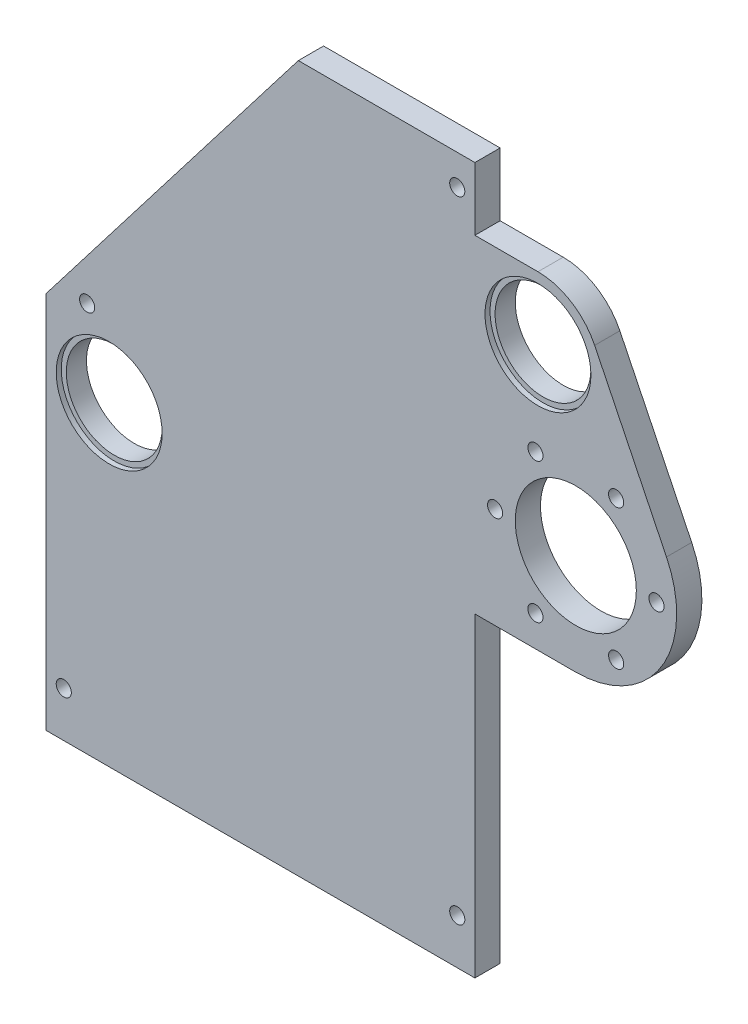
ISO-10303-21;
HEADER;
FILE_DESCRIPTION(('STEP AP214'),'2;1');
FILE_NAME('part.step','',(''),(''),'','','');
FILE_SCHEMA(('AUTOMOTIVE_DESIGN { 1 0 10303 214 1 1 1 1 }'));
ENDSEC;
DATA;
#1=APPLICATION_CONTEXT('core data for automotive mechanical design processes');
#2=APPLICATION_PROTOCOL_DEFINITION('international standard','automotive_design',2000,#1);
#3=PRODUCT_CONTEXT('',#1,'mechanical');
#4=PRODUCT('Part','Part','',(#3));
#5=PRODUCT_RELATED_PRODUCT_CATEGORY('part','',(#4));
#6=PRODUCT_DEFINITION_FORMATION('','',#4);
#7=PRODUCT_DEFINITION_CONTEXT('part definition',#1,'design');
#8=PRODUCT_DEFINITION('design','',#6,#7);
#9=PRODUCT_DEFINITION_SHAPE('','',#8);
#10=(LENGTH_UNIT() NAMED_UNIT(*) SI_UNIT(.MILLI.,.METRE.));
#11=(NAMED_UNIT(*) PLANE_ANGLE_UNIT() SI_UNIT($,.RADIAN.));
#12=(NAMED_UNIT(*) SI_UNIT($,.STERADIAN.) SOLID_ANGLE_UNIT());
#13=UNCERTAINTY_MEASURE_WITH_UNIT(LENGTH_MEASURE(1.E-05),#10,'distance_accuracy_value','');
#14=(GEOMETRIC_REPRESENTATION_CONTEXT(3) GLOBAL_UNCERTAINTY_ASSIGNED_CONTEXT((#13)) GLOBAL_UNIT_ASSIGNED_CONTEXT((#10,
#11,#12)) REPRESENTATION_CONTEXT('',''));
#15=CARTESIAN_POINT('',(0.,0.,0.));
#16=DIRECTION('',(0.,0.,1.));
#17=DIRECTION('',(1.,0.,0.));
#18=AXIS2_PLACEMENT_3D('',#15,#16,#17);
#19=CARTESIAN_POINT('',(115.111728317132,56.1169675546017,5.));
#20=DIRECTION('',(-0.898876404494382,-0.438202247191011,0.));
#21=DIRECTION('',(0.438202247191011,-0.898876404494382,0.));
#22=AXIS2_PLACEMENT_3D('',#19,#20,#21);
#23=PLANE('',#22);
#24=DIRECTION('',(-0.438202247191012,0.898876404494382,0.));
#25=VECTOR('',#24,1.);
#26=CARTESIAN_POINT('',(115.111728317132,56.1169675546017,0.));
#27=LINE('',#26,#25);
#28=CARTESIAN_POINT('',(97.9775280898877,91.2640449438203,0.));
#29=VERTEX_POINT('',#28);
#30=CARTESIAN_POINT('',(83.7359550561798,120.477528089888,0.));
#31=VERTEX_POINT('',#30);
#32=EDGE_CURVE('E219',#29,#31,#27,.T.);
#33=ORIENTED_EDGE('',*,*,#32,.T.);
#34=DIRECTION('',(0.,0.,-1.));
#35=VECTOR('',#34,1.);
#36=CARTESIAN_POINT('',(83.7359550561798,120.477528089888,5.));
#37=LINE('',#36,#35);
#38=CARTESIAN_POINT('',(83.7359550561798,120.477528089888,5.));
#39=VERTEX_POINT('',#38);
#40=EDGE_CURVE('E326',#39,#31,#37,.T.);
#41=ORIENTED_EDGE('',*,*,#40,.F.);
#42=DIRECTION('',(-0.438202247191012,0.898876404494382,0.));
#43=VECTOR('',#42,1.);
#44=CARTESIAN_POINT('',(115.111728317132,56.1169675546017,5.));
#45=LINE('',#44,#43);
#46=CARTESIAN_POINT('',(97.9775280898877,91.2640449438203,5.));
#47=VERTEX_POINT('',#46);
#48=EDGE_CURVE('E300',#47,#39,#45,.T.);
#49=ORIENTED_EDGE('',*,*,#48,.F.);
#50=DIRECTION('',(0.,0.,-1.));
#51=VECTOR('',#50,1.);
#52=CARTESIAN_POINT('',(97.9775280898877,91.2640449438203,5.));
#53=LINE('',#52,#51);
#54=EDGE_CURVE('E218',#47,#29,#53,.T.);
#55=ORIENTED_EDGE('',*,*,#54,.T.);
#56=EDGE_LOOP('',(#33,#41,#49,#55));
#57=FACE_BOUND('',#56,.T.);
#58=ADVANCED_FACE('F45',(#57),#23,.F.);
#59=CARTESIAN_POINT('',(72.5,115.,5.));
#60=DIRECTION('',(0.,0.,-1.));
#61=DIRECTION('',(-1.,0.,0.));
#62=AXIS2_PLACEMENT_3D('',#59,#60,#61);
#63=CYLINDRICAL_SURFACE('',#62,12.5);
#64=CARTESIAN_POINT('',(72.5,115.,0.));
#65=DIRECTION('',(0.,0.,1.));
#66=DIRECTION('',(1.,0.,0.));
#67=AXIS2_PLACEMENT_3D('',#64,#65,#66);
#68=CIRCLE('',#67,12.5);
#69=CARTESIAN_POINT('',(72.5,127.5,0.));
#70=VERTEX_POINT('',#69);
#71=EDGE_CURVE('E223',#31,#70,#68,.T.);
#72=ORIENTED_EDGE('',*,*,#71,.T.);
#73=DIRECTION('',(0.,0.,-1.));
#74=VECTOR('',#73,1.);
#75=CARTESIAN_POINT('',(72.5,127.5,5.));
#76=LINE('',#75,#74);
#77=CARTESIAN_POINT('',(72.5,127.5,5.));
#78=VERTEX_POINT('',#77);
#79=EDGE_CURVE('E322',#78,#70,#76,.T.);
#80=ORIENTED_EDGE('',*,*,#79,.F.);
#81=CARTESIAN_POINT('',(72.5,115.,5.));
#82=DIRECTION('',(0.,0.,1.));
#83=DIRECTION('',(1.,0.,0.));
#84=AXIS2_PLACEMENT_3D('',#81,#82,#83);
#85=CIRCLE('',#84,12.5);
#86=EDGE_CURVE('E111',#39,#78,#85,.T.);
#87=ORIENTED_EDGE('',*,*,#86,.F.);
#88=ORIENTED_EDGE('',*,*,#40,.T.);
#89=EDGE_LOOP('',(#72,#80,#87,#88));
#90=FACE_BOUND('',#89,.T.);
#91=ADVANCED_FACE('F438',(#90),#63,.T.);
#92=CARTESIAN_POINT('',(-2.83106871279415E-13,127.5,5.));
#93=DIRECTION('',(0.,-1.,0.));
#94=DIRECTION('',(1.,0.,0.));
#95=AXIS2_PLACEMENT_3D('',#92,#93,#94);
#96=PLANE('',#95);
#97=DIRECTION('',(-1.,0.,0.));
#98=VECTOR('',#97,1.);
#99=CARTESIAN_POINT('',(-2.83106871279415E-13,127.5,0.));
#100=LINE('',#99,#98);
#101=CARTESIAN_POINT('',(60.,127.5,0.));
#102=VERTEX_POINT('',#101);
#103=EDGE_CURVE('E227',#70,#102,#100,.T.);
#104=ORIENTED_EDGE('',*,*,#103,.T.);
#105=DIRECTION('',(0.,0.,-1.));
#106=VECTOR('',#105,1.);
#107=CARTESIAN_POINT('',(60.,127.5,5.));
#108=LINE('',#107,#106);
#109=CARTESIAN_POINT('',(60.,127.5,5.));
#110=VERTEX_POINT('',#109);
#111=EDGE_CURVE('E319',#110,#102,#108,.T.);
#112=ORIENTED_EDGE('',*,*,#111,.F.);
#113=DIRECTION('',(-1.,0.,0.));
#114=VECTOR('',#113,1.);
#115=CARTESIAN_POINT('',(-2.83106871279415E-13,127.5,5.));
#116=LINE('',#115,#114);
#117=EDGE_CURVE('E404',#78,#110,#116,.T.);
#118=ORIENTED_EDGE('',*,*,#117,.F.);
#119=ORIENTED_EDGE('',*,*,#79,.T.);
#120=EDGE_LOOP('',(#104,#112,#118,#119));
#121=FACE_BOUND('',#120,.T.);
#122=ADVANCED_FACE('F442',(#121),#96,.F.);
#123=CARTESIAN_POINT('',(60.,0.,5.));
#124=DIRECTION('',(1.,0.,0.));
#125=DIRECTION('',(0.,1.,0.));
#126=AXIS2_PLACEMENT_3D('',#123,#124,#125);
#127=PLANE('',#126);
#128=DIRECTION('',(0.,-1.,0.));
#129=VECTOR('',#128,1.);
#130=CARTESIAN_POINT('',(60.,0.,0.));
#131=LINE('',#130,#129);
#132=CARTESIAN_POINT('',(60.,140.,0.));
#133=VERTEX_POINT('',#132);
#134=EDGE_CURVE('E231',#133,#102,#131,.T.);
#135=ORIENTED_EDGE('',*,*,#134,.F.);
#136=DIRECTION('',(0.,0.,-1.));
#137=VECTOR('',#136,1.);
#138=CARTESIAN_POINT('',(60.,140.,5.));
#139=LINE('',#138,#137);
#140=CARTESIAN_POINT('',(60.,140.,5.));
#141=VERTEX_POINT('',#140);
#142=EDGE_CURVE('E316',#141,#133,#139,.T.);
#143=ORIENTED_EDGE('',*,*,#142,.F.);
#144=DIRECTION('',(0.,-1.,0.));
#145=VECTOR('',#144,1.);
#146=CARTESIAN_POINT('',(60.,0.,5.));
#147=LINE('',#146,#145);
#148=EDGE_CURVE('E157',#141,#110,#147,.T.);
#149=ORIENTED_EDGE('',*,*,#148,.T.);
#150=ORIENTED_EDGE('',*,*,#111,.T.);
#151=EDGE_LOOP('',(#135,#143,#149,#150));
#152=FACE_BOUND('',#151,.T.);
#153=ADVANCED_FACE('F446',(#152),#127,.T.);
#154=CARTESIAN_POINT('',(0.,140.,5.));
#155=DIRECTION('',(0.,1.,0.));
#156=DIRECTION('',(0.,0.,1.));
#157=AXIS2_PLACEMENT_3D('',#154,#155,#156);
#158=PLANE('',#157);
#159=DIRECTION('',(1.,0.,0.));
#160=VECTOR('',#159,1.);
#161=CARTESIAN_POINT('',(0.,140.,0.));
#162=LINE('',#161,#160);
#163=CARTESIAN_POINT('',(25.,140.,0.));
#164=VERTEX_POINT('',#163);
#165=EDGE_CURVE('E235',#164,#133,#162,.T.);
#166=ORIENTED_EDGE('',*,*,#165,.F.);
#167=DIRECTION('',(0.,0.,-1.));
#168=VECTOR('',#167,1.);
#169=CARTESIAN_POINT('',(25.,140.,5.));
#170=LINE('',#169,#168);
#171=CARTESIAN_POINT('',(25.,140.,5.));
#172=VERTEX_POINT('',#171);
#173=EDGE_CURVE('E313',#172,#164,#170,.T.);
#174=ORIENTED_EDGE('',*,*,#173,.F.);
#175=DIRECTION('',(1.,0.,0.));
#176=VECTOR('',#175,1.);
#177=CARTESIAN_POINT('',(0.,140.,5.));
#178=LINE('',#177,#176);
#179=EDGE_CURVE('E409',#172,#141,#178,.T.);
#180=ORIENTED_EDGE('',*,*,#179,.T.);
#181=ORIENTED_EDGE('',*,*,#142,.T.);
#182=EDGE_LOOP('',(#166,#174,#180,#181));
#183=FACE_BOUND('',#182,.T.);
#184=ADVANCED_FACE('F450',(#183),#158,.T.);
#185=CARTESIAN_POINT('',(-51.9516728624535,39.9628252788104,5.));
#186=DIRECTION('',(-0.7926239891046,0.609710760849692,0.));
#187=DIRECTION('',(-0.609710760849692,-0.7926239891046,0.));
#188=AXIS2_PLACEMENT_3D('',#185,#186,#187);
#189=PLANE('',#188);
#190=DIRECTION('',(0.609710760849692,0.7926239891046,0.));
#191=VECTOR('',#190,1.);
#192=CARTESIAN_POINT('',(-51.9516728624535,39.9628252788104,0.));
#193=LINE('',#192,#191);
#194=CARTESIAN_POINT('',(-25.,75.,0.));
#195=VERTEX_POINT('',#194);
#196=EDGE_CURVE('E239',#195,#164,#193,.T.);
#197=ORIENTED_EDGE('',*,*,#196,.F.);
#198=DIRECTION('',(0.,0.,-1.));
#199=VECTOR('',#198,1.);
#200=CARTESIAN_POINT('',(-25.,75.,5.));
#201=LINE('',#200,#199);
#202=CARTESIAN_POINT('',(-25.,75.,5.));
#203=VERTEX_POINT('',#202);
#204=EDGE_CURVE('E310',#203,#195,#201,.T.);
#205=ORIENTED_EDGE('',*,*,#204,.F.);
#206=DIRECTION('',(0.609710760849692,0.7926239891046,0.));
#207=VECTOR('',#206,1.);
#208=CARTESIAN_POINT('',(-51.9516728624535,39.9628252788104,5.));
#209=LINE('',#208,#207);
#210=EDGE_CURVE('E413',#203,#172,#209,.T.);
#211=ORIENTED_EDGE('',*,*,#210,.T.);
#212=ORIENTED_EDGE('',*,*,#173,.T.);
#213=EDGE_LOOP('',(#197,#205,#211,#212));
#214=FACE_BOUND('',#213,.T.);
#215=ADVANCED_FACE('F453',(#214),#189,.T.);
#216=CARTESIAN_POINT('',(-25.,0.,5.));
#217=DIRECTION('',(-1.,0.,0.));
#218=DIRECTION('',(0.,0.,1.));
#219=AXIS2_PLACEMENT_3D('',#216,#217,#218);
#220=PLANE('',#219);
#221=DIRECTION('',(0.,1.,0.));
#222=VECTOR('',#221,1.);
#223=CARTESIAN_POINT('',(-25.,0.,0.));
#224=LINE('',#223,#222);
#225=CARTESIAN_POINT('',(-25.,0.,0.));
#226=VERTEX_POINT('',#225);
#227=EDGE_CURVE('E243',#226,#195,#224,.T.);
#228=ORIENTED_EDGE('',*,*,#227,.F.);
#229=DIRECTION('',(0.,0.,-1.));
#230=VECTOR('',#229,1.);
#231=CARTESIAN_POINT('',(-25.,0.,5.));
#232=LINE('',#231,#230);
#233=CARTESIAN_POINT('',(-25.,0.,5.));
#234=VERTEX_POINT('',#233);
#235=EDGE_CURVE('E307',#234,#226,#232,.T.);
#236=ORIENTED_EDGE('',*,*,#235,.F.);
#237=DIRECTION('',(0.,1.,0.));
#238=VECTOR('',#237,1.);
#239=CARTESIAN_POINT('',(-25.,0.,5.));
#240=LINE('',#239,#238);
#241=EDGE_CURVE('E416',#234,#203,#240,.T.);
#242=ORIENTED_EDGE('',*,*,#241,.T.);
#243=ORIENTED_EDGE('',*,*,#204,.T.);
#244=EDGE_LOOP('',(#228,#236,#242,#243));
#245=FACE_BOUND('',#244,.T.);
#246=ADVANCED_FACE('F457',(#245),#220,.T.);
#247=CARTESIAN_POINT('',(0.,0.,5.));
#248=DIRECTION('',(0.,-1.,0.));
#249=DIRECTION('',(1.,0.,0.));
#250=AXIS2_PLACEMENT_3D('',#247,#248,#249);
#251=PLANE('',#250);
#252=DIRECTION('',(-1.,0.,0.));
#253=VECTOR('',#252,1.);
#254=CARTESIAN_POINT('',(0.,0.,0.));
#255=LINE('',#254,#253);
#256=CARTESIAN_POINT('',(60.,0.,0.));
#257=VERTEX_POINT('',#256);
#258=EDGE_CURVE('E247',#257,#226,#255,.T.);
#259=ORIENTED_EDGE('',*,*,#258,.F.);
#260=DIRECTION('',(0.,0.,-1.));
#261=VECTOR('',#260,1.);
#262=CARTESIAN_POINT('',(60.,0.,5.));
#263=LINE('',#262,#261);
#264=CARTESIAN_POINT('',(60.,0.,5.));
#265=VERTEX_POINT('',#264);
#266=EDGE_CURVE('E146',#265,#257,#263,.T.);
#267=ORIENTED_EDGE('',*,*,#266,.F.);
#268=DIRECTION('',(-1.,0.,0.));
#269=VECTOR('',#268,1.);
#270=CARTESIAN_POINT('',(0.,0.,5.));
#271=LINE('',#270,#269);
#272=EDGE_CURVE('E154',#265,#234,#271,.T.);
#273=ORIENTED_EDGE('',*,*,#272,.T.);
#274=ORIENTED_EDGE('',*,*,#235,.T.);
#275=EDGE_LOOP('',(#259,#267,#273,#274));
#276=FACE_BOUND('',#275,.T.);
#277=ADVANCED_FACE('F423',(#276),#251,.T.);
#278=CARTESIAN_POINT('',(60.,62.5,0.));
#279=VERTEX_POINT('',#278);
#280=EDGE_CURVE('E140',#279,#257,#131,.T.);
#281=ORIENTED_EDGE('',*,*,#280,.F.);
#282=DIRECTION('',(0.,0.,-1.));
#283=VECTOR('',#282,1.);
#284=CARTESIAN_POINT('',(60.,62.5,5.));
#285=LINE('',#284,#283);
#286=CARTESIAN_POINT('',(60.,62.5,5.));
#287=VERTEX_POINT('',#286);
#288=EDGE_CURVE('E135',#287,#279,#285,.T.);
#289=ORIENTED_EDGE('',*,*,#288,.F.);
#290=EDGE_CURVE('E138',#287,#265,#147,.T.);
#291=ORIENTED_EDGE('',*,*,#290,.T.);
#292=ORIENTED_EDGE('',*,*,#266,.T.);
#293=EDGE_LOOP('',(#281,#289,#291,#292));
#294=FACE_BOUND('',#293,.T.);
#295=ADVANCED_FACE('F137',(#294),#127,.T.);
#296=CARTESIAN_POINT('',(0.,62.5,5.));
#297=DIRECTION('',(0.,-1.,0.));
#298=DIRECTION('',(0.,0.,-1.));
#299=AXIS2_PLACEMENT_3D('',#296,#297,#298);
#300=PLANE('',#299);
#301=DIRECTION('',(-1.,0.,0.));
#302=VECTOR('',#301,1.);
#303=CARTESIAN_POINT('',(0.,62.5,0.));
#304=LINE('',#303,#302);
#305=CARTESIAN_POINT('',(80.,62.5,0.));
#306=VERTEX_POINT('',#305);
#307=EDGE_CURVE('E251',#306,#279,#304,.T.);
#308=ORIENTED_EDGE('',*,*,#307,.F.);
#309=DIRECTION('',(0.,0.,-1.));
#310=VECTOR('',#309,1.);
#311=CARTESIAN_POINT('',(80.,62.5,5.));
#312=LINE('',#311,#310);
#313=CARTESIAN_POINT('',(80.,62.5,5.));
#314=VERTEX_POINT('',#313);
#315=EDGE_CURVE('E99',#314,#306,#312,.T.);
#316=ORIENTED_EDGE('',*,*,#315,.F.);
#317=DIRECTION('',(-1.,0.,0.));
#318=VECTOR('',#317,1.);
#319=CARTESIAN_POINT('',(0.,62.5,5.));
#320=LINE('',#319,#318);
#321=EDGE_CURVE('E151',#314,#287,#320,.T.);
#322=ORIENTED_EDGE('',*,*,#321,.T.);
#323=ORIENTED_EDGE('',*,*,#288,.T.);
#324=EDGE_LOOP('',(#308,#316,#322,#323));
#325=FACE_BOUND('',#324,.T.);
#326=ADVANCED_FACE('F158',(#325),#300,.T.);
#327=CARTESIAN_POINT('',(64.,82.5,5.));
#328=DIRECTION('',(0.,0.,-1.));
#329=DIRECTION('',(-1.,0.,0.));
#330=AXIS2_PLACEMENT_3D('',#327,#328,#329);
#331=CYLINDRICAL_SURFACE('',#330,1.5);
#332=CARTESIAN_POINT('',(64.,82.5,5.));
#333=DIRECTION('',(0.,0.,1.));
#334=DIRECTION('',(1.,0.,0.));
#335=AXIS2_PLACEMENT_3D('',#332,#333,#334);
#336=CIRCLE('',#335,1.5);
#337=CARTESIAN_POINT('',(65.5,82.5,5.));
#338=VERTEX_POINT('',#337);
#339=EDGE_CURVE('E210',#338,#338,#336,.T.);
#340=ORIENTED_EDGE('',*,*,#339,.T.);
#341=EDGE_LOOP('',(#340));
#342=FACE_BOUND('',#341,.T.);
#343=CARTESIAN_POINT('',(64.,82.5,0.));
#344=DIRECTION('',(0.,0.,1.));
#345=DIRECTION('',(1.,0.,0.));
#346=AXIS2_PLACEMENT_3D('',#343,#344,#345);
#347=CIRCLE('',#346,1.5);
#348=CARTESIAN_POINT('',(65.5,82.5,0.));
#349=VERTEX_POINT('',#348);
#350=EDGE_CURVE('E292',#349,#349,#347,.T.);
#351=ORIENTED_EDGE('',*,*,#350,.F.);
#352=EDGE_LOOP('',(#351));
#353=FACE_BOUND('',#352,.T.);
#354=ADVANCED_FACE('F465',(#342,#353),#331,.F.);
#355=CARTESIAN_POINT('',(72.,96.356406460551,5.));
#356=DIRECTION('',(0.,0.,-1.));
#357=DIRECTION('',(-1.,0.,0.));
#358=AXIS2_PLACEMENT_3D('',#355,#356,#357);
#359=CYLINDRICAL_SURFACE('',#358,1.5);
#360=CARTESIAN_POINT('',(72.,96.356406460551,5.));
#361=DIRECTION('',(0.,0.,1.));
#362=DIRECTION('',(1.,0.,0.));
#363=AXIS2_PLACEMENT_3D('',#360,#361,#362);
#364=CIRCLE('',#363,1.5);
#365=CARTESIAN_POINT('',(73.5,96.356406460551,5.));
#366=VERTEX_POINT('',#365);
#367=EDGE_CURVE('E206',#366,#366,#364,.T.);
#368=ORIENTED_EDGE('',*,*,#367,.T.);
#369=EDGE_LOOP('',(#368));
#370=FACE_BOUND('',#369,.T.);
#371=CARTESIAN_POINT('',(72.,96.356406460551,0.));
#372=DIRECTION('',(0.,0.,1.));
#373=DIRECTION('',(1.,0.,0.));
#374=AXIS2_PLACEMENT_3D('',#371,#372,#373);
#375=CIRCLE('',#374,1.5);
#376=CARTESIAN_POINT('',(73.5,96.356406460551,0.));
#377=VERTEX_POINT('',#376);
#378=EDGE_CURVE('E288',#377,#377,#375,.T.);
#379=ORIENTED_EDGE('',*,*,#378,.F.);
#380=EDGE_LOOP('',(#379));
#381=FACE_BOUND('',#380,.T.);
#382=ADVANCED_FACE('F469',(#370,#381),#359,.F.);
#383=CARTESIAN_POINT('',(88.,96.356406460551,5.));
#384=DIRECTION('',(0.,0.,-1.));
#385=DIRECTION('',(-1.,0.,0.));
#386=AXIS2_PLACEMENT_3D('',#383,#384,#385);
#387=CYLINDRICAL_SURFACE('',#386,1.5);
#388=CARTESIAN_POINT('',(88.,96.356406460551,5.));
#389=DIRECTION('',(0.,0.,1.));
#390=DIRECTION('',(1.,0.,0.));
#391=AXIS2_PLACEMENT_3D('',#388,#389,#390);
#392=CIRCLE('',#391,1.5);
#393=CARTESIAN_POINT('',(89.5,96.356406460551,5.));
#394=VERTEX_POINT('',#393);
#395=EDGE_CURVE('E202',#394,#394,#392,.T.);
#396=ORIENTED_EDGE('',*,*,#395,.T.);
#397=EDGE_LOOP('',(#396));
#398=FACE_BOUND('',#397,.T.);
#399=CARTESIAN_POINT('',(88.,96.356406460551,0.));
#400=DIRECTION('',(0.,0.,1.));
#401=DIRECTION('',(1.,0.,0.));
#402=AXIS2_PLACEMENT_3D('',#399,#400,#401);
#403=CIRCLE('',#402,1.5);
#404=CARTESIAN_POINT('',(89.5,96.356406460551,0.));
#405=VERTEX_POINT('',#404);
#406=EDGE_CURVE('E284',#405,#405,#403,.T.);
#407=ORIENTED_EDGE('',*,*,#406,.F.);
#408=EDGE_LOOP('',(#407));
#409=FACE_BOUND('',#408,.T.);
#410=ADVANCED_FACE('F475',(#398,#409),#387,.F.);
#411=CARTESIAN_POINT('',(96.,82.5,5.));
#412=DIRECTION('',(0.,0.,-1.));
#413=DIRECTION('',(-1.,0.,0.));
#414=AXIS2_PLACEMENT_3D('',#411,#412,#413);
#415=CYLINDRICAL_SURFACE('',#414,1.49999999999998);
#416=CARTESIAN_POINT('',(96.,82.5,5.));
#417=DIRECTION('',(0.,0.,1.));
#418=DIRECTION('',(1.,0.,0.));
#419=AXIS2_PLACEMENT_3D('',#416,#417,#418);
#420=CIRCLE('',#419,1.49999999999998);
#421=CARTESIAN_POINT('',(97.5,82.5,5.));
#422=VERTEX_POINT('',#421);
#423=EDGE_CURVE('E198',#422,#422,#420,.T.);
#424=ORIENTED_EDGE('',*,*,#423,.T.);
#425=EDGE_LOOP('',(#424));
#426=FACE_BOUND('',#425,.T.);
#427=CARTESIAN_POINT('',(96.,82.5,0.));
#428=DIRECTION('',(0.,0.,1.));
#429=DIRECTION('',(1.,0.,0.));
#430=AXIS2_PLACEMENT_3D('',#427,#428,#429);
#431=CIRCLE('',#430,1.49999999999998);
#432=CARTESIAN_POINT('',(97.5,82.5,0.));
#433=VERTEX_POINT('',#432);
#434=EDGE_CURVE('E280',#433,#433,#431,.T.);
#435=ORIENTED_EDGE('',*,*,#434,.F.);
#436=EDGE_LOOP('',(#435));
#437=FACE_BOUND('',#436,.T.);
#438=ADVANCED_FACE('F482',(#426,#437),#415,.F.);
#439=CARTESIAN_POINT('',(88.,68.643593539449,5.));
#440=DIRECTION('',(0.,0.,-1.));
#441=DIRECTION('',(-1.,0.,0.));
#442=AXIS2_PLACEMENT_3D('',#439,#440,#441);
#443=CYLINDRICAL_SURFACE('',#442,1.49999999999998);
#444=CARTESIAN_POINT('',(88.,68.643593539449,5.));
#445=DIRECTION('',(0.,0.,1.));
#446=DIRECTION('',(1.,0.,0.));
#447=AXIS2_PLACEMENT_3D('',#444,#445,#446);
#448=CIRCLE('',#447,1.49999999999998);
#449=CARTESIAN_POINT('',(89.5,68.643593539449,5.));
#450=VERTEX_POINT('',#449);
#451=EDGE_CURVE('E194',#450,#450,#448,.T.);
#452=ORIENTED_EDGE('',*,*,#451,.T.);
#453=EDGE_LOOP('',(#452));
#454=FACE_BOUND('',#453,.T.);
#455=CARTESIAN_POINT('',(88.,68.643593539449,0.));
#456=DIRECTION('',(0.,0.,1.));
#457=DIRECTION('',(1.,0.,0.));
#458=AXIS2_PLACEMENT_3D('',#455,#456,#457);
#459=CIRCLE('',#458,1.49999999999998);
#460=CARTESIAN_POINT('',(89.5,68.643593539449,0.));
#461=VERTEX_POINT('',#460);
#462=EDGE_CURVE('E276',#461,#461,#459,.T.);
#463=ORIENTED_EDGE('',*,*,#462,.F.);
#464=EDGE_LOOP('',(#463));
#465=FACE_BOUND('',#464,.T.);
#466=ADVANCED_FACE('F486',(#454,#465),#443,.F.);
#467=CARTESIAN_POINT('',(72.,68.643593539449,5.));
#468=DIRECTION('',(0.,0.,-1.));
#469=DIRECTION('',(-1.,0.,0.));
#470=AXIS2_PLACEMENT_3D('',#467,#468,#469);
#471=CYLINDRICAL_SURFACE('',#470,1.5);
#472=CARTESIAN_POINT('',(72.,68.643593539449,5.));
#473=DIRECTION('',(0.,0.,1.));
#474=DIRECTION('',(1.,0.,0.));
#475=AXIS2_PLACEMENT_3D('',#472,#473,#474);
#476=CIRCLE('',#475,1.5);
#477=CARTESIAN_POINT('',(73.5,68.643593539449,5.));
#478=VERTEX_POINT('',#477);
#479=EDGE_CURVE('E190',#478,#478,#476,.T.);
#480=ORIENTED_EDGE('',*,*,#479,.T.);
#481=EDGE_LOOP('',(#480));
#482=FACE_BOUND('',#481,.T.);
#483=CARTESIAN_POINT('',(72.,68.643593539449,0.));
#484=DIRECTION('',(0.,0.,1.));
#485=DIRECTION('',(1.,0.,0.));
#486=AXIS2_PLACEMENT_3D('',#483,#484,#485);
#487=CIRCLE('',#486,1.5);
#488=CARTESIAN_POINT('',(73.5,68.643593539449,0.));
#489=VERTEX_POINT('',#488);
#490=EDGE_CURVE('E272',#489,#489,#487,.T.);
#491=ORIENTED_EDGE('',*,*,#490,.F.);
#492=EDGE_LOOP('',(#491));
#493=FACE_BOUND('',#492,.T.);
#494=ADVANCED_FACE('F490',(#482,#493),#471,.F.);
#495=CARTESIAN_POINT('',(72.5,115.,5.));
#496=DIRECTION('',(0.,0.,-1.));
#497=DIRECTION('',(-1.,0.,0.));
#498=AXIS2_PLACEMENT_3D('',#495,#496,#497);
#499=CYLINDRICAL_SURFACE('',#498,10.5);
#500=CARTESIAN_POINT('',(72.5,115.,4.));
#501=DIRECTION('',(0.,0.,1.));
#502=DIRECTION('',(1.,0.,0.));
#503=AXIS2_PLACEMENT_3D('',#500,#501,#502);
#504=CIRCLE('',#503,10.5);
#505=CARTESIAN_POINT('',(83.,115.,4.));
#506=VERTEX_POINT('',#505);
#507=EDGE_CURVE('E11',#506,#506,#504,.T.);
#508=ORIENTED_EDGE('',*,*,#507,.F.);
#509=EDGE_LOOP('',(#508));
#510=FACE_BOUND('',#509,.T.);
#511=CARTESIAN_POINT('',(72.5,115.,5.));
#512=DIRECTION('',(0.,0.,1.));
#513=DIRECTION('',(1.,0.,0.));
#514=AXIS2_PLACEMENT_3D('',#511,#512,#513);
#515=CIRCLE('',#514,10.5);
#516=CARTESIAN_POINT('',(83.,115.,5.));
#517=VERTEX_POINT('',#516);
#518=EDGE_CURVE('E186',#517,#517,#515,.T.);
#519=ORIENTED_EDGE('',*,*,#518,.T.);
#520=EDGE_LOOP('',(#519));
#521=FACE_BOUND('',#520,.T.);
#522=ADVANCED_FACE('F494',(#510,#521),#499,.F.);
#523=CARTESIAN_POINT('',(-16.8671906487463,77.3720424232014,5.));
#524=DIRECTION('',(0.,0.,-1.));
#525=DIRECTION('',(-1.,0.,0.));
#526=AXIS2_PLACEMENT_3D('',#523,#524,#525);
#527=CYLINDRICAL_SURFACE('',#526,1.5);
#528=CARTESIAN_POINT('',(-16.8671906487463,77.3720424232014,5.));
#529=DIRECTION('',(0.,0.,1.));
#530=DIRECTION('',(1.,0.,0.));
#531=AXIS2_PLACEMENT_3D('',#528,#529,#530);
#532=CIRCLE('',#531,1.5);
#533=CARTESIAN_POINT('',(-15.3671906487463,77.3720424232014,5.));
#534=VERTEX_POINT('',#533);
#535=EDGE_CURVE('E182',#534,#534,#532,.T.);
#536=ORIENTED_EDGE('',*,*,#535,.T.);
#537=EDGE_LOOP('',(#536));
#538=FACE_BOUND('',#537,.T.);
#539=CARTESIAN_POINT('',(-16.8671906487463,77.3720424232014,0.));
#540=DIRECTION('',(0.,0.,1.));
#541=DIRECTION('',(1.,0.,0.));
#542=AXIS2_PLACEMENT_3D('',#539,#540,#541);
#543=CIRCLE('',#542,1.5);
#544=CARTESIAN_POINT('',(-15.3671906487463,77.3720424232014,0.));
#545=VERTEX_POINT('',#544);
#546=EDGE_CURVE('E268',#545,#545,#543,.T.);
#547=ORIENTED_EDGE('',*,*,#546,.F.);
#548=EDGE_LOOP('',(#547));
#549=FACE_BOUND('',#548,.T.);
#550=ADVANCED_FACE('F498',(#538,#549),#527,.F.);
#551=CARTESIAN_POINT('',(56.5,134.,5.));
#552=DIRECTION('',(0.,0.,-1.));
#553=DIRECTION('',(-1.,0.,0.));
#554=AXIS2_PLACEMENT_3D('',#551,#552,#553);
#555=CYLINDRICAL_SURFACE('',#554,1.5);
#556=CARTESIAN_POINT('',(56.5,134.,5.));
#557=DIRECTION('',(0.,0.,1.));
#558=DIRECTION('',(1.,0.,0.));
#559=AXIS2_PLACEMENT_3D('',#556,#557,#558);
#560=CIRCLE('',#559,1.5);
#561=CARTESIAN_POINT('',(58.,134.,5.));
#562=VERTEX_POINT('',#561);
#563=EDGE_CURVE('E178',#562,#562,#560,.T.);
#564=ORIENTED_EDGE('',*,*,#563,.T.);
#565=EDGE_LOOP('',(#564));
#566=FACE_BOUND('',#565,.T.);
#567=CARTESIAN_POINT('',(56.5,134.,0.));
#568=DIRECTION('',(0.,0.,1.));
#569=DIRECTION('',(1.,0.,0.));
#570=AXIS2_PLACEMENT_3D('',#567,#568,#569);
#571=CIRCLE('',#570,1.5);
#572=CARTESIAN_POINT('',(58.,134.,0.));
#573=VERTEX_POINT('',#572);
#574=EDGE_CURVE('E264',#573,#573,#571,.T.);
#575=ORIENTED_EDGE('',*,*,#574,.F.);
#576=EDGE_LOOP('',(#575));
#577=FACE_BOUND('',#576,.T.);
#578=ADVANCED_FACE('F502',(#566,#577),#555,.F.);
#579=CARTESIAN_POINT('',(56.5,9.00000000000001,5.));
#580=DIRECTION('',(0.,0.,-1.));
#581=DIRECTION('',(-1.,0.,0.));
#582=AXIS2_PLACEMENT_3D('',#579,#580,#581);
#583=CYLINDRICAL_SURFACE('',#582,1.5);
#584=CARTESIAN_POINT('',(56.5,9.00000000000001,5.));
#585=DIRECTION('',(0.,0.,1.));
#586=DIRECTION('',(1.,0.,0.));
#587=AXIS2_PLACEMENT_3D('',#584,#585,#586);
#588=CIRCLE('',#587,1.5);
#589=CARTESIAN_POINT('',(58.,9.00000000000001,5.));
#590=VERTEX_POINT('',#589);
#591=EDGE_CURVE('E174',#590,#590,#588,.T.);
#592=ORIENTED_EDGE('',*,*,#591,.T.);
#593=EDGE_LOOP('',(#592));
#594=FACE_BOUND('',#593,.T.);
#595=CARTESIAN_POINT('',(56.5,9.00000000000001,0.));
#596=DIRECTION('',(0.,0.,1.));
#597=DIRECTION('',(1.,0.,0.));
#598=AXIS2_PLACEMENT_3D('',#595,#596,#597);
#599=CIRCLE('',#598,1.5);
#600=CARTESIAN_POINT('',(58.,9.00000000000001,0.));
#601=VERTEX_POINT('',#600);
#602=EDGE_CURVE('E260',#601,#601,#599,.T.);
#603=ORIENTED_EDGE('',*,*,#602,.F.);
#604=EDGE_LOOP('',(#603));
#605=FACE_BOUND('',#604,.T.);
#606=ADVANCED_FACE('F506',(#594,#605),#583,.F.);
#607=CARTESIAN_POINT('',(-21.5,9.00000000000001,5.));
#608=DIRECTION('',(0.,0.,-1.));
#609=DIRECTION('',(-1.,0.,0.));
#610=AXIS2_PLACEMENT_3D('',#607,#608,#609);
#611=CYLINDRICAL_SURFACE('',#610,1.5);
#612=CARTESIAN_POINT('',(-21.5,9.00000000000001,5.));
#613=DIRECTION('',(0.,0.,1.));
#614=DIRECTION('',(1.,0.,0.));
#615=AXIS2_PLACEMENT_3D('',#612,#613,#614);
#616=CIRCLE('',#615,1.5);
#617=CARTESIAN_POINT('',(-20.,9.00000000000001,5.));
#618=VERTEX_POINT('',#617);
#619=EDGE_CURVE('E170',#618,#618,#616,.T.);
#620=ORIENTED_EDGE('',*,*,#619,.T.);
#621=EDGE_LOOP('',(#620));
#622=FACE_BOUND('',#621,.T.);
#623=CARTESIAN_POINT('',(-21.5,9.00000000000001,0.));
#624=DIRECTION('',(0.,0.,1.));
#625=DIRECTION('',(1.,0.,0.));
#626=AXIS2_PLACEMENT_3D('',#623,#624,#625);
#627=CIRCLE('',#626,1.5);
#628=CARTESIAN_POINT('',(-20.,9.00000000000001,0.));
#629=VERTEX_POINT('',#628);
#630=EDGE_CURVE('E256',#629,#629,#627,.T.);
#631=ORIENTED_EDGE('',*,*,#630,.F.);
#632=EDGE_LOOP('',(#631));
#633=FACE_BOUND('',#632,.T.);
#634=ADVANCED_FACE('F338',(#622,#633),#611,.F.);
#635=CARTESIAN_POINT('',(-12.5,62.5,5.));
#636=DIRECTION('',(0.,0.,-1.));
#637=DIRECTION('',(-1.,0.,0.));
#638=AXIS2_PLACEMENT_3D('',#635,#636,#637);
#639=CYLINDRICAL_SURFACE('',#638,10.5);
#640=CARTESIAN_POINT('',(-12.5,62.5,4.));
#641=DIRECTION('',(0.,0.,1.));
#642=DIRECTION('',(1.,0.,0.));
#643=AXIS2_PLACEMENT_3D('',#640,#641,#642);
#644=CIRCLE('',#643,10.5);
#645=CARTESIAN_POINT('',(-2.,62.5,4.));
#646=VERTEX_POINT('',#645);
#647=EDGE_CURVE('E54',#646,#646,#644,.T.);
#648=ORIENTED_EDGE('',*,*,#647,.F.);
#649=EDGE_LOOP('',(#648));
#650=FACE_BOUND('',#649,.T.);
#651=CARTESIAN_POINT('',(-12.5,62.5,5.));
#652=DIRECTION('',(0.,0.,1.));
#653=DIRECTION('',(1.,0.,0.));
#654=AXIS2_PLACEMENT_3D('',#651,#652,#653);
#655=CIRCLE('',#654,10.5);
#656=CARTESIAN_POINT('',(-2.,62.5,5.));
#657=VERTEX_POINT('',#656);
#658=EDGE_CURVE('E162',#657,#657,#655,.T.);
#659=ORIENTED_EDGE('',*,*,#658,.T.);
#660=EDGE_LOOP('',(#659));
#661=FACE_BOUND('',#660,.T.);
#662=ADVANCED_FACE('F334',(#650,#661),#639,.F.);
#663=CARTESIAN_POINT('',(80.,82.5,5.));
#664=DIRECTION('',(0.,0.,-1.));
#665=DIRECTION('',(-1.,0.,0.));
#666=AXIS2_PLACEMENT_3D('',#663,#664,#665);
#667=CYLINDRICAL_SURFACE('',#666,20.);
#668=CARTESIAN_POINT('',(80.,82.5,0.));
#669=DIRECTION('',(0.,0.,1.));
#670=DIRECTION('',(1.,0.,0.));
#671=AXIS2_PLACEMENT_3D('',#668,#669,#670);
#672=CIRCLE('',#671,20.);
#673=EDGE_CURVE('E102',#306,#29,#672,.T.);
#674=ORIENTED_EDGE('',*,*,#673,.T.);
#675=ORIENTED_EDGE('',*,*,#54,.F.);
#676=CARTESIAN_POINT('',(80.,82.5,5.));
#677=DIRECTION('',(0.,0.,1.));
#678=DIRECTION('',(1.,0.,0.));
#679=AXIS2_PLACEMENT_3D('',#676,#677,#678);
#680=CIRCLE('',#679,20.);
#681=EDGE_CURVE('E62',#314,#47,#680,.T.);
#682=ORIENTED_EDGE('',*,*,#681,.F.);
#683=ORIENTED_EDGE('',*,*,#315,.T.);
#684=EDGE_LOOP('',(#674,#675,#682,#683));
#685=FACE_BOUND('',#684,.T.);
#686=ADVANCED_FACE('F337',(#685),#667,.T.);
#687=CARTESIAN_POINT('',(80.,82.5,5.));
#688=DIRECTION('',(0.,0.,-1.));
#689=DIRECTION('',(-1.,0.,0.));
#690=AXIS2_PLACEMENT_3D('',#687,#688,#689);
#691=CYLINDRICAL_SURFACE('',#690,12.);
#692=CARTESIAN_POINT('',(80.,82.5,5.));
#693=DIRECTION('',(0.,0.,1.));
#694=DIRECTION('',(1.,0.,0.));
#695=AXIS2_PLACEMENT_3D('',#692,#693,#694);
#696=CIRCLE('',#695,12.);
#697=CARTESIAN_POINT('',(92.0000000000001,82.5,5.));
#698=VERTEX_POINT('',#697);
#699=EDGE_CURVE('E214',#698,#698,#696,.T.);
#700=ORIENTED_EDGE('',*,*,#699,.T.);
#701=EDGE_LOOP('',(#700));
#702=FACE_BOUND('',#701,.T.);
#703=CARTESIAN_POINT('',(80.,82.5,0.));
#704=DIRECTION('',(0.,0.,1.));
#705=DIRECTION('',(1.,0.,0.));
#706=AXIS2_PLACEMENT_3D('',#703,#704,#705);
#707=CIRCLE('',#706,12.);
#708=CARTESIAN_POINT('',(92.0000000000001,82.5,0.));
#709=VERTEX_POINT('',#708);
#710=EDGE_CURVE('E296',#709,#709,#707,.T.);
#711=ORIENTED_EDGE('',*,*,#710,.F.);
#712=EDGE_LOOP('',(#711));
#713=FACE_BOUND('',#712,.T.);
#714=ADVANCED_FACE('F344',(#702,#713),#691,.F.);
#715=CARTESIAN_POINT('',(0.,0.,5.));
#716=DIRECTION('',(0.,0.,1.));
#717=DIRECTION('',(1.,0.,0.));
#718=AXIS2_PLACEMENT_3D('',#715,#716,#717);
#719=PLANE('',#718);
#720=ORIENTED_EDGE('',*,*,#48,.T.);
#721=ORIENTED_EDGE('',*,*,#86,.T.);
#722=ORIENTED_EDGE('',*,*,#117,.T.);
#723=ORIENTED_EDGE('',*,*,#148,.F.);
#724=ORIENTED_EDGE('',*,*,#179,.F.);
#725=ORIENTED_EDGE('',*,*,#210,.F.);
#726=ORIENTED_EDGE('',*,*,#241,.F.);
#727=ORIENTED_EDGE('',*,*,#272,.F.);
#728=ORIENTED_EDGE('',*,*,#290,.F.);
#729=ORIENTED_EDGE('',*,*,#321,.F.);
#730=ORIENTED_EDGE('',*,*,#681,.T.);
#731=EDGE_LOOP('',(#720,#721,#722,#723,#724,#725,#726,#727,#728,#729,#730));
#732=FACE_BOUND('',#731,.T.);
#733=ORIENTED_EDGE('',*,*,#658,.F.);
#734=EDGE_LOOP('',(#733));
#735=FACE_BOUND('',#734,.T.);
#736=ORIENTED_EDGE('',*,*,#619,.F.);
#737=EDGE_LOOP('',(#736));
#738=FACE_BOUND('',#737,.T.);
#739=ORIENTED_EDGE('',*,*,#591,.F.);
#740=EDGE_LOOP('',(#739));
#741=FACE_BOUND('',#740,.T.);
#742=ORIENTED_EDGE('',*,*,#563,.F.);
#743=EDGE_LOOP('',(#742));
#744=FACE_BOUND('',#743,.T.);
#745=ORIENTED_EDGE('',*,*,#535,.F.);
#746=EDGE_LOOP('',(#745));
#747=FACE_BOUND('',#746,.T.);
#748=ORIENTED_EDGE('',*,*,#518,.F.);
#749=EDGE_LOOP('',(#748));
#750=FACE_BOUND('',#749,.T.);
#751=ORIENTED_EDGE('',*,*,#479,.F.);
#752=EDGE_LOOP('',(#751));
#753=FACE_BOUND('',#752,.T.);
#754=ORIENTED_EDGE('',*,*,#451,.F.);
#755=EDGE_LOOP('',(#754));
#756=FACE_BOUND('',#755,.T.);
#757=ORIENTED_EDGE('',*,*,#423,.F.);
#758=EDGE_LOOP('',(#757));
#759=FACE_BOUND('',#758,.T.);
#760=ORIENTED_EDGE('',*,*,#395,.F.);
#761=EDGE_LOOP('',(#760));
#762=FACE_BOUND('',#761,.T.);
#763=ORIENTED_EDGE('',*,*,#367,.F.);
#764=EDGE_LOOP('',(#763));
#765=FACE_BOUND('',#764,.T.);
#766=ORIENTED_EDGE('',*,*,#339,.F.);
#767=EDGE_LOOP('',(#766));
#768=FACE_BOUND('',#767,.T.);
#769=ORIENTED_EDGE('',*,*,#699,.F.);
#770=EDGE_LOOP('',(#769));
#771=FACE_BOUND('',#770,.T.);
#772=ADVANCED_FACE('F149',(#732,#735,#738,#741,#744,#747,#750,#753,#756,#759,#762,#765,#768,
#771),#719,.T.);
#773=CARTESIAN_POINT('',(0.,0.,0.));
#774=DIRECTION('',(0.,0.,1.));
#775=DIRECTION('',(1.,0.,0.));
#776=AXIS2_PLACEMENT_3D('',#773,#774,#775);
#777=PLANE('',#776);
#778=ORIENTED_EDGE('',*,*,#32,.F.);
#779=ORIENTED_EDGE('',*,*,#673,.F.);
#780=ORIENTED_EDGE('',*,*,#307,.T.);
#781=ORIENTED_EDGE('',*,*,#280,.T.);
#782=ORIENTED_EDGE('',*,*,#258,.T.);
#783=ORIENTED_EDGE('',*,*,#227,.T.);
#784=ORIENTED_EDGE('',*,*,#196,.T.);
#785=ORIENTED_EDGE('',*,*,#165,.T.);
#786=ORIENTED_EDGE('',*,*,#134,.T.);
#787=ORIENTED_EDGE('',*,*,#103,.F.);
#788=ORIENTED_EDGE('',*,*,#71,.F.);
#789=EDGE_LOOP('',(#778,#779,#780,#781,#782,#783,#784,#785,#786,#787,#788));
#790=FACE_BOUND('',#789,.T.);
#791=ORIENTED_EDGE('',*,*,#630,.T.);
#792=EDGE_LOOP('',(#791));
#793=FACE_BOUND('',#792,.T.);
#794=ORIENTED_EDGE('',*,*,#602,.T.);
#795=EDGE_LOOP('',(#794));
#796=FACE_BOUND('',#795,.T.);
#797=ORIENTED_EDGE('',*,*,#574,.T.);
#798=EDGE_LOOP('',(#797));
#799=FACE_BOUND('',#798,.T.);
#800=ORIENTED_EDGE('',*,*,#546,.T.);
#801=EDGE_LOOP('',(#800));
#802=FACE_BOUND('',#801,.T.);
#803=ORIENTED_EDGE('',*,*,#490,.T.);
#804=EDGE_LOOP('',(#803));
#805=FACE_BOUND('',#804,.T.);
#806=ORIENTED_EDGE('',*,*,#462,.T.);
#807=EDGE_LOOP('',(#806));
#808=FACE_BOUND('',#807,.T.);
#809=ORIENTED_EDGE('',*,*,#434,.T.);
#810=EDGE_LOOP('',(#809));
#811=FACE_BOUND('',#810,.T.);
#812=ORIENTED_EDGE('',*,*,#406,.T.);
#813=EDGE_LOOP('',(#812));
#814=FACE_BOUND('',#813,.T.);
#815=ORIENTED_EDGE('',*,*,#378,.T.);
#816=EDGE_LOOP('',(#815));
#817=FACE_BOUND('',#816,.T.);
#818=ORIENTED_EDGE('',*,*,#350,.T.);
#819=EDGE_LOOP('',(#818));
#820=FACE_BOUND('',#819,.T.);
#821=ORIENTED_EDGE('',*,*,#710,.T.);
#822=EDGE_LOOP('',(#821));
#823=FACE_BOUND('',#822,.T.);
#824=CARTESIAN_POINT('',(-12.5,62.5,0.));
#825=DIRECTION('',(0.,0.,1.));
#826=DIRECTION('',(1.,0.,0.));
#827=AXIS2_PLACEMENT_3D('',#824,#825,#826);
#828=CIRCLE('',#827,9.5);
#829=CARTESIAN_POINT('',(-3.,62.5,0.));
#830=VERTEX_POINT('',#829);
#831=EDGE_CURVE('E383',#830,#830,#828,.T.);
#832=ORIENTED_EDGE('',*,*,#831,.T.);
#833=EDGE_LOOP('',(#832));
#834=FACE_BOUND('',#833,.T.);
#835=CARTESIAN_POINT('',(72.5,115.,0.));
#836=DIRECTION('',(0.,0.,1.));
#837=DIRECTION('',(1.,0.,0.));
#838=AXIS2_PLACEMENT_3D('',#835,#836,#837);
#839=CIRCLE('',#838,9.49999999999999);
#840=CARTESIAN_POINT('',(82.,115.,0.));
#841=VERTEX_POINT('',#840);
#842=EDGE_CURVE('E386',#841,#841,#839,.T.);
#843=ORIENTED_EDGE('',*,*,#842,.T.);
#844=EDGE_LOOP('',(#843));
#845=FACE_BOUND('',#844,.T.);
#846=ADVANCED_FACE('F343',(#790,#793,#796,#799,#802,#805,#808,#811,#814,#817,#820,#823,#834,
#845),#777,.F.);
#847=CARTESIAN_POINT('',(-12.5,62.5,4.));
#848=DIRECTION('',(0.,0.,-1.));
#849=DIRECTION('',(-1.,0.,0.));
#850=AXIS2_PLACEMENT_3D('',#847,#848,#849);
#851=CYLINDRICAL_SURFACE('',#850,9.5);
#852=CARTESIAN_POINT('',(-12.5,62.5,4.));
#853=DIRECTION('',(0.,0.,1.));
#854=DIRECTION('',(1.,0.,0.));
#855=AXIS2_PLACEMENT_3D('',#852,#853,#854);
#856=CIRCLE('',#855,9.5);
#857=CARTESIAN_POINT('',(-3.,62.5,4.));
#858=VERTEX_POINT('',#857);
#859=EDGE_CURVE('E224',#858,#858,#856,.T.);
#860=ORIENTED_EDGE('',*,*,#859,.T.);
#861=EDGE_LOOP('',(#860));
#862=FACE_BOUND('',#861,.T.);
#863=ORIENTED_EDGE('',*,*,#831,.F.);
#864=EDGE_LOOP('',(#863));
#865=FACE_BOUND('',#864,.T.);
#866=ADVANCED_FACE('F377',(#862,#865),#851,.F.);
#867=CARTESIAN_POINT('',(0.,0.,4.));
#868=DIRECTION('',(0.,0.,1.));
#869=DIRECTION('',(1.,0.,0.));
#870=AXIS2_PLACEMENT_3D('',#867,#868,#869);
#871=PLANE('',#870);
#872=ORIENTED_EDGE('',*,*,#859,.F.);
#873=EDGE_LOOP('',(#872));
#874=FACE_BOUND('',#873,.T.);
#875=ORIENTED_EDGE('',*,*,#647,.T.);
#876=EDGE_LOOP('',(#875));
#877=FACE_BOUND('',#876,.T.);
#878=ADVANCED_FACE('F332',(#874,#877),#871,.T.);
#879=CARTESIAN_POINT('',(72.5,115.,4.));
#880=DIRECTION('',(0.,0.,-1.));
#881=DIRECTION('',(-1.,0.,0.));
#882=AXIS2_PLACEMENT_3D('',#879,#880,#881);
#883=CYLINDRICAL_SURFACE('',#882,9.49999999999999);
#884=CARTESIAN_POINT('',(72.5,115.,4.));
#885=DIRECTION('',(0.,0.,1.));
#886=DIRECTION('',(1.,0.,0.));
#887=AXIS2_PLACEMENT_3D('',#884,#885,#886);
#888=CIRCLE('',#887,9.49999999999999);
#889=CARTESIAN_POINT('',(82.,115.,4.));
#890=VERTEX_POINT('',#889);
#891=EDGE_CURVE('E389',#890,#890,#888,.T.);
#892=ORIENTED_EDGE('',*,*,#891,.T.);
#893=EDGE_LOOP('',(#892));
#894=FACE_BOUND('',#893,.T.);
#895=ORIENTED_EDGE('',*,*,#842,.F.);
#896=EDGE_LOOP('',(#895));
#897=FACE_BOUND('',#896,.T.);
#898=ADVANCED_FACE('F581',(#894,#897),#883,.F.);
#899=CARTESIAN_POINT('',(0.,0.,4.));
#900=DIRECTION('',(0.,0.,1.));
#901=DIRECTION('',(1.,0.,0.));
#902=AXIS2_PLACEMENT_3D('',#899,#900,#901);
#903=PLANE('',#902);
#904=ORIENTED_EDGE('',*,*,#891,.F.);
#905=EDGE_LOOP('',(#904));
#906=FACE_BOUND('',#905,.T.);
#907=ORIENTED_EDGE('',*,*,#507,.T.);
#908=EDGE_LOOP('',(#907));
#909=FACE_BOUND('',#908,.T.);
#910=ADVANCED_FACE('F592',(#906,#909),#903,.T.);
#911=CLOSED_SHELL('',(#58,#91,#122,#153,#184,#215,#246,#277,#295,#326,#354,#382,#410,#438,#466,
#494,#522,#550,#578,#606,#634,#662,#686,#714,#772,#846,#866,#878,#898,#910));
#912=MANIFOLD_SOLID_BREP('B2',#911);
#913=ADVANCED_BREP_SHAPE_REPRESENTATION('',(#18,#912),#14);
#914=SHAPE_DEFINITION_REPRESENTATION(#9,#913);
ENDSEC;
END-ISO-10303-21;
